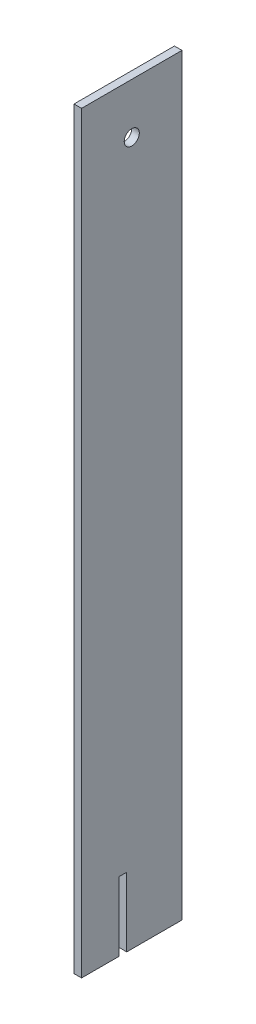
ISO-10303-21;
HEADER;
FILE_DESCRIPTION(('STEP AP214'),'2;1');
FILE_NAME('part.step','',(''),(''),'','','');
FILE_SCHEMA(('AUTOMOTIVE_DESIGN { 1 0 10303 214 1 1 1 1 }'));
ENDSEC;
DATA;
#1=APPLICATION_CONTEXT('core data for automotive mechanical design processes');
#2=APPLICATION_PROTOCOL_DEFINITION('international standard','automotive_design',2000,#1);
#3=PRODUCT_CONTEXT('',#1,'mechanical');
#4=PRODUCT('Part','Part','',(#3));
#5=PRODUCT_RELATED_PRODUCT_CATEGORY('part','',(#4));
#6=PRODUCT_DEFINITION_FORMATION('','',#4);
#7=PRODUCT_DEFINITION_CONTEXT('part definition',#1,'design');
#8=PRODUCT_DEFINITION('design','',#6,#7);
#9=PRODUCT_DEFINITION_SHAPE('','',#8);
#10=(LENGTH_UNIT() NAMED_UNIT(*) SI_UNIT(.MILLI.,.METRE.));
#11=(NAMED_UNIT(*) PLANE_ANGLE_UNIT() SI_UNIT($,.RADIAN.));
#12=(NAMED_UNIT(*) SI_UNIT($,.STERADIAN.) SOLID_ANGLE_UNIT());
#13=UNCERTAINTY_MEASURE_WITH_UNIT(LENGTH_MEASURE(1.E-05),#10,'distance_accuracy_value','');
#14=(GEOMETRIC_REPRESENTATION_CONTEXT(3) GLOBAL_UNCERTAINTY_ASSIGNED_CONTEXT((#13)) GLOBAL_UNIT_ASSIGNED_CONTEXT((#10,
#11,#12)) REPRESENTATION_CONTEXT('',''));
#15=CARTESIAN_POINT('',(0.,0.,0.));
#16=DIRECTION('',(0.,0.,1.));
#17=DIRECTION('',(1.,0.,0.));
#18=AXIS2_PLACEMENT_3D('',#15,#16,#17);
#19=CARTESIAN_POINT('',(3.,-150.,20.));
#20=DIRECTION('',(0.,1.,0.));
#21=DIRECTION('',(0.,0.,1.));
#22=AXIS2_PLACEMENT_3D('',#19,#20,#21);
#23=PLANE('',#22);
#24=DIRECTION('',(0.,0.,-1.));
#25=VECTOR('',#24,1.);
#26=CARTESIAN_POINT('',(3.,-150.,20.));
#27=LINE('',#26,#25);
#28=CARTESIAN_POINT('',(3.,-150.,1.99999999974408));
#29=VERTEX_POINT('',#28);
#30=CARTESIAN_POINT('',(3.,-150.,-20.));
#31=VERTEX_POINT('',#30);
#32=EDGE_CURVE('E57',#29,#31,#27,.T.);
#33=ORIENTED_EDGE('',*,*,#32,.F.);
#34=DIRECTION('',(1.,0.,0.));
#35=VECTOR('',#34,1.);
#36=CARTESIAN_POINT('',(0.,-150.,1.99999999974408));
#37=LINE('',#36,#35);
#38=CARTESIAN_POINT('',(0.,-150.,1.99999999974408));
#39=VERTEX_POINT('',#38);
#40=EDGE_CURVE('E134',#39,#29,#37,.T.);
#41=ORIENTED_EDGE('',*,*,#40,.F.);
#42=DIRECTION('',(0.,0.,-1.));
#43=VECTOR('',#42,1.);
#44=CARTESIAN_POINT('',(0.,-150.,20.));
#45=LINE('',#44,#43);
#46=CARTESIAN_POINT('',(0.,-150.,-20.));
#47=VERTEX_POINT('',#46);
#48=EDGE_CURVE('E79',#39,#47,#45,.T.);
#49=ORIENTED_EDGE('',*,*,#48,.T.);
#50=DIRECTION('',(-1.,0.,0.));
#51=VECTOR('',#50,1.);
#52=CARTESIAN_POINT('',(3.,-150.,-20.));
#53=LINE('',#52,#51);
#54=EDGE_CURVE('E156',#31,#47,#53,.T.);
#55=ORIENTED_EDGE('',*,*,#54,.F.);
#56=EDGE_LOOP('',(#33,#41,#49,#55));
#57=FACE_BOUND('',#56,.T.);
#58=ADVANCED_FACE('F33',(#57),#23,.F.);
#59=CARTESIAN_POINT('',(3.,-150.,-20.));
#60=DIRECTION('',(0.,0.,1.));
#61=DIRECTION('',(1.,0.,0.));
#62=AXIS2_PLACEMENT_3D('',#59,#60,#61);
#63=PLANE('',#62);
#64=DIRECTION('',(0.,1.,0.));
#65=VECTOR('',#64,1.);
#66=CARTESIAN_POINT('',(0.,-150.,-20.));
#67=LINE('',#66,#65);
#68=CARTESIAN_POINT('',(0.,150.,-20.));
#69=VERTEX_POINT('',#68);
#70=EDGE_CURVE('E144',#47,#69,#67,.T.);
#71=ORIENTED_EDGE('',*,*,#70,.T.);
#72=DIRECTION('',(-1.,0.,0.));
#73=VECTOR('',#72,1.);
#74=CARTESIAN_POINT('',(3.,150.,-20.));
#75=LINE('',#74,#73);
#76=CARTESIAN_POINT('',(3.,150.,-20.));
#77=VERTEX_POINT('',#76);
#78=EDGE_CURVE('E11',#77,#69,#75,.T.);
#79=ORIENTED_EDGE('',*,*,#78,.F.);
#80=DIRECTION('',(0.,1.,0.));
#81=VECTOR('',#80,1.);
#82=CARTESIAN_POINT('',(3.,-150.,-20.));
#83=LINE('',#82,#81);
#84=EDGE_CURVE('E147',#31,#77,#83,.T.);
#85=ORIENTED_EDGE('',*,*,#84,.F.);
#86=ORIENTED_EDGE('',*,*,#54,.T.);
#87=EDGE_LOOP('',(#71,#79,#85,#86));
#88=FACE_BOUND('',#87,.T.);
#89=ADVANCED_FACE('F35',(#88),#63,.F.);
#90=CARTESIAN_POINT('',(3.,150.,20.));
#91=DIRECTION('',(0.,-1.,0.));
#92=DIRECTION('',(0.,0.,-1.));
#93=AXIS2_PLACEMENT_3D('',#90,#91,#92);
#94=PLANE('',#93);
#95=DIRECTION('',(0.,0.,1.));
#96=VECTOR('',#95,1.);
#97=CARTESIAN_POINT('',(0.,150.,20.));
#98=LINE('',#97,#96);
#99=CARTESIAN_POINT('',(0.,150.,20.));
#100=VERTEX_POINT('',#99);
#101=EDGE_CURVE('E159',#69,#100,#98,.T.);
#102=ORIENTED_EDGE('',*,*,#101,.T.);
#103=DIRECTION('',(-1.,0.,0.));
#104=VECTOR('',#103,1.);
#105=CARTESIAN_POINT('',(3.,150.,20.));
#106=LINE('',#105,#104);
#107=CARTESIAN_POINT('',(3.,150.,20.));
#108=VERTEX_POINT('',#107);
#109=EDGE_CURVE('E41',#108,#100,#106,.T.);
#110=ORIENTED_EDGE('',*,*,#109,.F.);
#111=DIRECTION('',(0.,0.,1.));
#112=VECTOR('',#111,1.);
#113=CARTESIAN_POINT('',(3.,150.,20.));
#114=LINE('',#113,#112);
#115=EDGE_CURVE('E86',#77,#108,#114,.T.);
#116=ORIENTED_EDGE('',*,*,#115,.F.);
#117=ORIENTED_EDGE('',*,*,#78,.T.);
#118=EDGE_LOOP('',(#102,#110,#116,#117));
#119=FACE_BOUND('',#118,.T.);
#120=ADVANCED_FACE('F183',(#119),#94,.F.);
#121=CARTESIAN_POINT('',(3.,-150.,20.));
#122=DIRECTION('',(0.,0.,-1.));
#123=DIRECTION('',(-1.,0.,0.));
#124=AXIS2_PLACEMENT_3D('',#121,#122,#123);
#125=PLANE('',#124);
#126=DIRECTION('',(0.,-1.,0.));
#127=VECTOR('',#126,1.);
#128=CARTESIAN_POINT('',(0.,-150.,20.));
#129=LINE('',#128,#127);
#130=CARTESIAN_POINT('',(0.,-150.,20.));
#131=VERTEX_POINT('',#130);
#132=EDGE_CURVE('E161',#100,#131,#129,.T.);
#133=ORIENTED_EDGE('',*,*,#132,.T.);
#134=DIRECTION('',(-1.,0.,0.));
#135=VECTOR('',#134,1.);
#136=CARTESIAN_POINT('',(3.,-150.,20.));
#137=LINE('',#136,#135);
#138=CARTESIAN_POINT('',(3.,-150.,20.));
#139=VERTEX_POINT('',#138);
#140=EDGE_CURVE('E166',#139,#131,#137,.T.);
#141=ORIENTED_EDGE('',*,*,#140,.F.);
#142=DIRECTION('',(0.,-1.,0.));
#143=VECTOR('',#142,1.);
#144=CARTESIAN_POINT('',(3.,-150.,20.));
#145=LINE('',#144,#143);
#146=EDGE_CURVE('E151',#108,#139,#145,.T.);
#147=ORIENTED_EDGE('',*,*,#146,.F.);
#148=ORIENTED_EDGE('',*,*,#109,.T.);
#149=EDGE_LOOP('',(#133,#141,#147,#148));
#150=FACE_BOUND('',#149,.T.);
#151=ADVANCED_FACE('F172',(#150),#125,.F.);
#152=CARTESIAN_POINT('',(0.,-150.,4.99999999974408));
#153=VERTEX_POINT('',#152);
#154=EDGE_CURVE('E149',#131,#153,#45,.T.);
#155=ORIENTED_EDGE('',*,*,#154,.T.);
#156=DIRECTION('',(1.,0.,0.));
#157=VECTOR('',#156,1.);
#158=CARTESIAN_POINT('',(0.,-150.,4.99999999974408));
#159=LINE('',#158,#157);
#160=CARTESIAN_POINT('',(3.,-150.,4.99999999974408));
#161=VERTEX_POINT('',#160);
#162=EDGE_CURVE('E137',#153,#161,#159,.T.);
#163=ORIENTED_EDGE('',*,*,#162,.T.);
#164=EDGE_CURVE('E153',#139,#161,#27,.T.);
#165=ORIENTED_EDGE('',*,*,#164,.F.);
#166=ORIENTED_EDGE('',*,*,#140,.T.);
#167=EDGE_LOOP('',(#155,#163,#165,#166));
#168=FACE_BOUND('',#167,.T.);
#169=ADVANCED_FACE('F176',(#168),#23,.F.);
#170=CARTESIAN_POINT('',(3.,0.,0.));
#171=DIRECTION('',(-1.,0.,0.));
#172=DIRECTION('',(0.,0.,1.));
#173=AXIS2_PLACEMENT_3D('',#170,#171,#172);
#174=PLANE('',#173);
#175=CARTESIAN_POINT('',(3.,130.,0.));
#176=DIRECTION('',(1.,0.,0.));
#177=DIRECTION('',(0.,0.,-1.));
#178=AXIS2_PLACEMENT_3D('',#175,#176,#177);
#179=CIRCLE('',#178,3.);
#180=CARTESIAN_POINT('',(3.,130.,-3.));
#181=VERTEX_POINT('',#180);
#182=EDGE_CURVE('E136',#181,#181,#179,.T.);
#183=ORIENTED_EDGE('',*,*,#182,.F.);
#184=EDGE_LOOP('',(#183));
#185=FACE_BOUND('',#184,.T.);
#186=DIRECTION('',(0.,0.,1.));
#187=VECTOR('',#186,1.);
#188=CARTESIAN_POINT('',(3.,-122.500000000046,1.99999999974408));
#189=LINE('',#188,#187);
#190=CARTESIAN_POINT('',(3.,-122.500000000046,1.99999999974408));
#191=VERTEX_POINT('',#190);
#192=CARTESIAN_POINT('',(3.,-122.500000000046,4.99999999974408));
#193=VERTEX_POINT('',#192);
#194=EDGE_CURVE('E128',#191,#193,#189,.T.);
#195=ORIENTED_EDGE('',*,*,#194,.F.);
#196=DIRECTION('',(0.,1.,0.));
#197=VECTOR('',#196,1.);
#198=CARTESIAN_POINT('',(3.,-122.500000000046,1.99999999974408));
#199=LINE('',#198,#197);
#200=EDGE_CURVE('E112',#29,#191,#199,.T.);
#201=ORIENTED_EDGE('',*,*,#200,.F.);
#202=ORIENTED_EDGE('',*,*,#32,.T.);
#203=ORIENTED_EDGE('',*,*,#84,.T.);
#204=ORIENTED_EDGE('',*,*,#115,.T.);
#205=ORIENTED_EDGE('',*,*,#146,.T.);
#206=ORIENTED_EDGE('',*,*,#164,.T.);
#207=DIRECTION('',(0.,-1.,0.));
#208=VECTOR('',#207,1.);
#209=CARTESIAN_POINT('',(3.,-122.500000000046,4.99999999974408));
#210=LINE('',#209,#208);
#211=EDGE_CURVE('E126',#193,#161,#210,.T.);
#212=ORIENTED_EDGE('',*,*,#211,.F.);
#213=EDGE_LOOP('',(#195,#201,#202,#203,#204,#205,#206,#212));
#214=FACE_BOUND('',#213,.T.);
#215=ADVANCED_FACE('F179',(#185,#214),#174,.F.);
#216=CARTESIAN_POINT('',(0.,0.,0.));
#217=DIRECTION('',(-1.,0.,0.));
#218=DIRECTION('',(0.,0.,1.));
#219=AXIS2_PLACEMENT_3D('',#216,#217,#218);
#220=PLANE('',#219);
#221=DIRECTION('',(0.,1.,0.));
#222=VECTOR('',#221,1.);
#223=CARTESIAN_POINT('',(0.,-122.500000000046,1.99999999974408));
#224=LINE('',#223,#222);
#225=CARTESIAN_POINT('',(0.,-122.500000000046,1.99999999974408));
#226=VERTEX_POINT('',#225);
#227=EDGE_CURVE('E111',#39,#226,#224,.T.);
#228=ORIENTED_EDGE('',*,*,#227,.T.);
#229=DIRECTION('',(0.,0.,1.));
#230=VECTOR('',#229,1.);
#231=CARTESIAN_POINT('',(0.,-122.500000000046,1.99999999974408));
#232=LINE('',#231,#230);
#233=CARTESIAN_POINT('',(0.,-122.500000000046,4.99999999974408));
#234=VERTEX_POINT('',#233);
#235=EDGE_CURVE('E119',#226,#234,#232,.T.);
#236=ORIENTED_EDGE('',*,*,#235,.T.);
#237=DIRECTION('',(0.,-1.,0.));
#238=VECTOR('',#237,1.);
#239=CARTESIAN_POINT('',(0.,-122.500000000046,4.99999999974408));
#240=LINE('',#239,#238);
#241=EDGE_CURVE('E48',#234,#153,#240,.T.);
#242=ORIENTED_EDGE('',*,*,#241,.T.);
#243=ORIENTED_EDGE('',*,*,#154,.F.);
#244=ORIENTED_EDGE('',*,*,#132,.F.);
#245=ORIENTED_EDGE('',*,*,#101,.F.);
#246=ORIENTED_EDGE('',*,*,#70,.F.);
#247=ORIENTED_EDGE('',*,*,#48,.F.);
#248=EDGE_LOOP('',(#228,#236,#242,#243,#244,#245,#246,#247));
#249=FACE_BOUND('',#248,.T.);
#250=CARTESIAN_POINT('',(0.,130.,0.));
#251=DIRECTION('',(1.,0.,0.));
#252=DIRECTION('',(0.,0.,-1.));
#253=AXIS2_PLACEMENT_3D('',#250,#251,#252);
#254=CIRCLE('',#253,3.);
#255=CARTESIAN_POINT('',(0.,130.,-3.));
#256=VERTEX_POINT('',#255);
#257=EDGE_CURVE('E141',#256,#256,#254,.T.);
#258=ORIENTED_EDGE('',*,*,#257,.T.);
#259=EDGE_LOOP('',(#258));
#260=FACE_BOUND('',#259,.T.);
#261=ADVANCED_FACE('F123',(#249,#260),#220,.T.);
#262=CARTESIAN_POINT('',(0.,130.,0.));
#263=DIRECTION('',(1.,0.,0.));
#264=DIRECTION('',(0.,0.,-1.));
#265=AXIS2_PLACEMENT_3D('',#262,#263,#264);
#266=CYLINDRICAL_SURFACE('',#265,3.);
#267=ORIENTED_EDGE('',*,*,#257,.F.);
#268=EDGE_LOOP('',(#267));
#269=FACE_BOUND('',#268,.T.);
#270=ORIENTED_EDGE('',*,*,#182,.T.);
#271=EDGE_LOOP('',(#270));
#272=FACE_BOUND('',#271,.T.);
#273=ADVANCED_FACE('F205',(#269,#272),#266,.F.);
#274=CARTESIAN_POINT('',(0.,-122.500000000046,1.99999999974408));
#275=DIRECTION('',(0.,0.,-1.));
#276=DIRECTION('',(0.,1.,0.));
#277=AXIS2_PLACEMENT_3D('',#274,#275,#276);
#278=PLANE('',#277);
#279=ORIENTED_EDGE('',*,*,#200,.T.);
#280=DIRECTION('',(1.,0.,0.));
#281=VECTOR('',#280,1.);
#282=CARTESIAN_POINT('',(0.,-122.500000000046,1.99999999974408));
#283=LINE('',#282,#281);
#284=EDGE_CURVE('E107',#226,#191,#283,.T.);
#285=ORIENTED_EDGE('',*,*,#284,.F.);
#286=ORIENTED_EDGE('',*,*,#227,.F.);
#287=ORIENTED_EDGE('',*,*,#40,.T.);
#288=EDGE_LOOP('',(#279,#285,#286,#287));
#289=FACE_BOUND('',#288,.T.);
#290=ADVANCED_FACE('F109',(#289),#278,.F.);
#291=CARTESIAN_POINT('',(0.,-122.500000000046,4.99999999974408));
#292=DIRECTION('',(0.,0.,1.));
#293=DIRECTION('',(1.,0.,0.));
#294=AXIS2_PLACEMENT_3D('',#291,#292,#293);
#295=PLANE('',#294);
#296=ORIENTED_EDGE('',*,*,#211,.T.);
#297=ORIENTED_EDGE('',*,*,#162,.F.);
#298=ORIENTED_EDGE('',*,*,#241,.F.);
#299=DIRECTION('',(1.,0.,0.));
#300=VECTOR('',#299,1.);
#301=CARTESIAN_POINT('',(0.,-122.500000000046,4.99999999974408));
#302=LINE('',#301,#300);
#303=EDGE_CURVE('E116',#234,#193,#302,.T.);
#304=ORIENTED_EDGE('',*,*,#303,.T.);
#305=EDGE_LOOP('',(#296,#297,#298,#304));
#306=FACE_BOUND('',#305,.T.);
#307=ADVANCED_FACE('F213',(#306),#295,.F.);
#308=CARTESIAN_POINT('',(0.,-122.500000000046,1.99999999974408));
#309=DIRECTION('',(0.,1.,0.));
#310=DIRECTION('',(0.,0.,1.));
#311=AXIS2_PLACEMENT_3D('',#308,#309,#310);
#312=PLANE('',#311);
#313=ORIENTED_EDGE('',*,*,#194,.T.);
#314=ORIENTED_EDGE('',*,*,#303,.F.);
#315=ORIENTED_EDGE('',*,*,#235,.F.);
#316=ORIENTED_EDGE('',*,*,#284,.T.);
#317=EDGE_LOOP('',(#313,#314,#315,#316));
#318=FACE_BOUND('',#317,.T.);
#319=ADVANCED_FACE('F120',(#318),#312,.F.);
#320=CLOSED_SHELL('',(#58,#89,#120,#151,#169,#215,#261,#273,#290,#307,#319));
#321=MANIFOLD_SOLID_BREP('B2',#320);
#322=ADVANCED_BREP_SHAPE_REPRESENTATION('',(#18,#321),#14);
#323=SHAPE_DEFINITION_REPRESENTATION(#9,#322);
ENDSEC;
END-ISO-10303-21;
